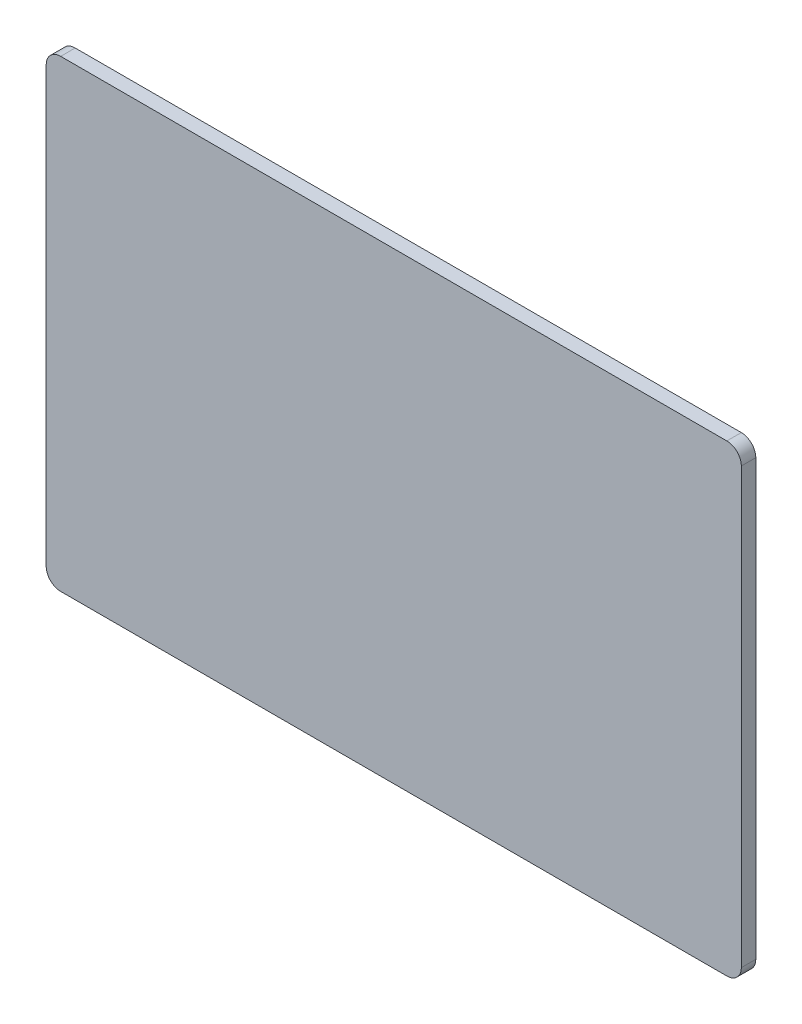
ISO-10303-21;
HEADER;
FILE_DESCRIPTION(('STEP AP214'),'2;1');
FILE_NAME('part.step','',(''),(''),'','','');
FILE_SCHEMA(('AUTOMOTIVE_DESIGN { 1 0 10303 214 1 1 1 1 }'));
ENDSEC;
DATA;
#1=APPLICATION_CONTEXT('core data for automotive mechanical design processes');
#2=APPLICATION_PROTOCOL_DEFINITION('international standard','automotive_design',2000,#1);
#3=PRODUCT_CONTEXT('',#1,'mechanical');
#4=PRODUCT('Part','Part','',(#3));
#5=PRODUCT_RELATED_PRODUCT_CATEGORY('part','',(#4));
#6=PRODUCT_DEFINITION_FORMATION('','',#4);
#7=PRODUCT_DEFINITION_CONTEXT('part definition',#1,'design');
#8=PRODUCT_DEFINITION('design','',#6,#7);
#9=PRODUCT_DEFINITION_SHAPE('','',#8);
#10=(LENGTH_UNIT() NAMED_UNIT(*) SI_UNIT(.MILLI.,.METRE.));
#11=(NAMED_UNIT(*) PLANE_ANGLE_UNIT() SI_UNIT($,.RADIAN.));
#12=(NAMED_UNIT(*) SI_UNIT($,.STERADIAN.) SOLID_ANGLE_UNIT());
#13=UNCERTAINTY_MEASURE_WITH_UNIT(LENGTH_MEASURE(1.E-05),#10,'distance_accuracy_value','');
#14=(GEOMETRIC_REPRESENTATION_CONTEXT(3) GLOBAL_UNCERTAINTY_ASSIGNED_CONTEXT((#13)) GLOBAL_UNIT_ASSIGNED_CONTEXT((#10,
#11,#12)) REPRESENTATION_CONTEXT('',''));
#15=CARTESIAN_POINT('',(0.,0.,0.));
#16=DIRECTION('',(0.,0.,1.));
#17=DIRECTION('',(1.,0.,0.));
#18=AXIS2_PLACEMENT_3D('',#15,#16,#17);
#19=CARTESIAN_POINT('',(0.,0.,1.5875));
#20=DIRECTION('',(1.,0.,0.));
#21=DIRECTION('',(0.,0.,-1.));
#22=AXIS2_PLACEMENT_3D('',#19,#20,#21);
#23=PLANE('',#22);
#24=DIRECTION('',(0.,-1.,0.));
#25=VECTOR('',#24,1.);
#26=CARTESIAN_POINT('',(0.,0.,0.));
#27=LINE('',#26,#25);
#28=CARTESIAN_POINT('',(0.,49.2125,0.));
#29=VERTEX_POINT('',#28);
#30=CARTESIAN_POINT('',(0.,1.5875,0.));
#31=VERTEX_POINT('',#30);
#32=EDGE_CURVE('E133',#29,#31,#27,.T.);
#33=ORIENTED_EDGE('',*,*,#32,.T.);
#34=DIRECTION('',(0.,0.,-1.));
#35=VECTOR('',#34,1.);
#36=CARTESIAN_POINT('',(0.,1.5875,1.5875));
#37=LINE('',#36,#35);
#38=CARTESIAN_POINT('',(0.,1.5875,1.5875));
#39=VERTEX_POINT('',#38);
#40=EDGE_CURVE('E112',#31,#39,#37,.F.);
#41=ORIENTED_EDGE('',*,*,#40,.T.);
#42=DIRECTION('',(0.,-1.,0.));
#43=VECTOR('',#42,1.);
#44=CARTESIAN_POINT('',(0.,0.,1.5875));
#45=LINE('',#44,#43);
#46=CARTESIAN_POINT('',(0.,49.2125,1.5875));
#47=VERTEX_POINT('',#46);
#48=EDGE_CURVE('E141',#47,#39,#45,.T.);
#49=ORIENTED_EDGE('',*,*,#48,.F.);
#50=DIRECTION('',(0.,0.,-1.));
#51=VECTOR('',#50,1.);
#52=CARTESIAN_POINT('',(0.,49.2125,1.5875));
#53=LINE('',#52,#51);
#54=EDGE_CURVE('E119',#47,#29,#53,.T.);
#55=ORIENTED_EDGE('',*,*,#54,.T.);
#56=EDGE_LOOP('',(#33,#41,#49,#55));
#57=FACE_BOUND('',#56,.T.);
#58=ADVANCED_FACE('F39',(#57),#23,.F.);
#59=CARTESIAN_POINT('',(0.,0.,1.5875));
#60=DIRECTION('',(0.,1.,0.));
#61=DIRECTION('',(0.,0.,1.));
#62=AXIS2_PLACEMENT_3D('',#59,#60,#61);
#63=PLANE('',#62);
#64=DIRECTION('',(1.,0.,0.));
#65=VECTOR('',#64,1.);
#66=CARTESIAN_POINT('',(0.,0.,1.5875));
#67=LINE('',#66,#65);
#68=CARTESIAN_POINT('',(1.5875,0.,1.5875));
#69=VERTEX_POINT('',#68);
#70=CARTESIAN_POINT('',(74.6125,0.,1.5875));
#71=VERTEX_POINT('',#70);
#72=EDGE_CURVE('E127',#69,#71,#67,.T.);
#73=ORIENTED_EDGE('',*,*,#72,.F.);
#74=DIRECTION('',(0.,0.,-1.));
#75=VECTOR('',#74,1.);
#76=CARTESIAN_POINT('',(1.5875,0.,1.5875));
#77=LINE('',#76,#75);
#78=CARTESIAN_POINT('',(1.5875,0.,0.));
#79=VERTEX_POINT('',#78);
#80=EDGE_CURVE('E109',#69,#79,#77,.T.);
#81=ORIENTED_EDGE('',*,*,#80,.T.);
#82=DIRECTION('',(1.,0.,0.));
#83=VECTOR('',#82,1.);
#84=CARTESIAN_POINT('',(0.,0.,0.));
#85=LINE('',#84,#83);
#86=CARTESIAN_POINT('',(74.6125,0.,0.));
#87=VERTEX_POINT('',#86);
#88=EDGE_CURVE('E122',#79,#87,#85,.T.);
#89=ORIENTED_EDGE('',*,*,#88,.T.);
#90=DIRECTION('',(0.,0.,-1.));
#91=VECTOR('',#90,1.);
#92=CARTESIAN_POINT('',(74.6125,0.,1.5875));
#93=LINE('',#92,#91);
#94=EDGE_CURVE('E126',#87,#71,#93,.F.);
#95=ORIENTED_EDGE('',*,*,#94,.T.);
#96=EDGE_LOOP('',(#73,#81,#89,#95));
#97=FACE_BOUND('',#96,.T.);
#98=ADVANCED_FACE('F125',(#97),#63,.F.);
#99=CARTESIAN_POINT('',(76.2,0.,1.5875));
#100=DIRECTION('',(-1.,0.,0.));
#101=DIRECTION('',(0.,0.,1.));
#102=AXIS2_PLACEMENT_3D('',#99,#100,#101);
#103=PLANE('',#102);
#104=DIRECTION('',(0.,1.,0.));
#105=VECTOR('',#104,1.);
#106=CARTESIAN_POINT('',(76.2,0.,1.5875));
#107=LINE('',#106,#105);
#108=CARTESIAN_POINT('',(76.2,1.5875,1.5875));
#109=VERTEX_POINT('',#108);
#110=CARTESIAN_POINT('',(76.2,49.2125,1.5875));
#111=VERTEX_POINT('',#110);
#112=EDGE_CURVE('E167',#109,#111,#107,.T.);
#113=ORIENTED_EDGE('',*,*,#112,.F.);
#114=DIRECTION('',(0.,0.,-1.));
#115=VECTOR('',#114,1.);
#116=CARTESIAN_POINT('',(76.2,1.5875,1.5875));
#117=LINE('',#116,#115);
#118=CARTESIAN_POINT('',(76.2,1.5875,0.));
#119=VERTEX_POINT('',#118);
#120=EDGE_CURVE('E11',#109,#119,#117,.T.);
#121=ORIENTED_EDGE('',*,*,#120,.T.);
#122=DIRECTION('',(0.,1.,0.));
#123=VECTOR('',#122,1.);
#124=CARTESIAN_POINT('',(76.2,0.,0.));
#125=LINE('',#124,#123);
#126=CARTESIAN_POINT('',(76.2,49.2125,0.));
#127=VERTEX_POINT('',#126);
#128=EDGE_CURVE('E135',#119,#127,#125,.T.);
#129=ORIENTED_EDGE('',*,*,#128,.T.);
#130=DIRECTION('',(0.,0.,-1.));
#131=VECTOR('',#130,1.);
#132=CARTESIAN_POINT('',(76.2,49.2125,1.5875));
#133=LINE('',#132,#131);
#134=EDGE_CURVE('E50',#127,#111,#133,.F.);
#135=ORIENTED_EDGE('',*,*,#134,.T.);
#136=EDGE_LOOP('',(#113,#121,#129,#135));
#137=FACE_BOUND('',#136,.T.);
#138=ADVANCED_FACE('F164',(#137),#103,.F.);
#139=CARTESIAN_POINT('',(0.,50.8,1.5875));
#140=DIRECTION('',(0.,-1.,0.));
#141=DIRECTION('',(0.,0.,-1.));
#142=AXIS2_PLACEMENT_3D('',#139,#140,#141);
#143=PLANE('',#142);
#144=DIRECTION('',(-1.,0.,0.));
#145=VECTOR('',#144,1.);
#146=CARTESIAN_POINT('',(0.,50.8,0.));
#147=LINE('',#146,#145);
#148=CARTESIAN_POINT('',(74.6125,50.8,0.));
#149=VERTEX_POINT('',#148);
#150=CARTESIAN_POINT('',(1.5875,50.8,0.));
#151=VERTEX_POINT('',#150);
#152=EDGE_CURVE('E140',#149,#151,#147,.T.);
#153=ORIENTED_EDGE('',*,*,#152,.T.);
#154=DIRECTION('',(0.,0.,-1.));
#155=VECTOR('',#154,1.);
#156=CARTESIAN_POINT('',(1.5875,50.8,1.5875));
#157=LINE('',#156,#155);
#158=CARTESIAN_POINT('',(1.5875,50.8,1.5875));
#159=VERTEX_POINT('',#158);
#160=EDGE_CURVE('E53',#151,#159,#157,.F.);
#161=ORIENTED_EDGE('',*,*,#160,.T.);
#162=DIRECTION('',(-1.,0.,0.));
#163=VECTOR('',#162,1.);
#164=CARTESIAN_POINT('',(0.,50.8,1.5875));
#165=LINE('',#164,#163);
#166=CARTESIAN_POINT('',(74.6125,50.8,1.5875));
#167=VERTEX_POINT('',#166);
#168=EDGE_CURVE('E145',#167,#159,#165,.T.);
#169=ORIENTED_EDGE('',*,*,#168,.F.);
#170=DIRECTION('',(0.,0.,-1.));
#171=VECTOR('',#170,1.);
#172=CARTESIAN_POINT('',(74.6125,50.8,1.5875));
#173=LINE('',#172,#171);
#174=EDGE_CURVE('E157',#167,#149,#173,.T.);
#175=ORIENTED_EDGE('',*,*,#174,.T.);
#176=EDGE_LOOP('',(#153,#161,#169,#175));
#177=FACE_BOUND('',#176,.T.);
#178=ADVANCED_FACE('F172',(#177),#143,.F.);
#179=CARTESIAN_POINT('',(0.,0.,1.5875));
#180=DIRECTION('',(0.,0.,-1.));
#181=DIRECTION('',(-1.,0.,0.));
#182=AXIS2_PLACEMENT_3D('',#179,#180,#181);
#183=PLANE('',#182);
#184=ORIENTED_EDGE('',*,*,#48,.T.);
#185=CARTESIAN_POINT('',(1.5875,1.5875,1.5875));
#186=DIRECTION('',(0.,0.,-1.));
#187=DIRECTION('',(-1.,0.,0.));
#188=AXIS2_PLACEMENT_3D('',#185,#186,#187);
#189=CIRCLE('',#188,1.5875);
#190=EDGE_CURVE('E160',#39,#69,#189,.F.);
#191=ORIENTED_EDGE('',*,*,#190,.T.);
#192=ORIENTED_EDGE('',*,*,#72,.T.);
#193=CARTESIAN_POINT('',(74.6125,1.5875,1.5875));
#194=DIRECTION('',(0.,0.,-1.));
#195=DIRECTION('',(-1.,0.,0.));
#196=AXIS2_PLACEMENT_3D('',#193,#194,#195);
#197=CIRCLE('',#196,1.5875);
#198=EDGE_CURVE('E153',#71,#109,#197,.F.);
#199=ORIENTED_EDGE('',*,*,#198,.T.);
#200=ORIENTED_EDGE('',*,*,#112,.T.);
#201=CARTESIAN_POINT('',(74.6125,49.2125,1.5875));
#202=DIRECTION('',(0.,0.,-1.));
#203=DIRECTION('',(-1.,0.,0.));
#204=AXIS2_PLACEMENT_3D('',#201,#202,#203);
#205=CIRCLE('',#204,1.5875);
#206=EDGE_CURVE('E64',#111,#167,#205,.F.);
#207=ORIENTED_EDGE('',*,*,#206,.T.);
#208=ORIENTED_EDGE('',*,*,#168,.T.);
#209=CARTESIAN_POINT('',(1.5875,49.2125,1.5875));
#210=DIRECTION('',(0.,0.,-1.));
#211=DIRECTION('',(-1.,0.,0.));
#212=AXIS2_PLACEMENT_3D('',#209,#210,#211);
#213=CIRCLE('',#212,1.5875);
#214=EDGE_CURVE('E154',#159,#47,#213,.F.);
#215=ORIENTED_EDGE('',*,*,#214,.T.);
#216=EDGE_LOOP('',(#184,#191,#192,#199,#200,#207,#208,#215));
#217=FACE_BOUND('',#216,.T.);
#218=ADVANCED_FACE('F168',(#217),#183,.F.);
#219=CARTESIAN_POINT('',(0.,0.,0.));
#220=DIRECTION('',(0.,0.,-1.));
#221=DIRECTION('',(-1.,0.,0.));
#222=AXIS2_PLACEMENT_3D('',#219,#220,#221);
#223=PLANE('',#222);
#224=ORIENTED_EDGE('',*,*,#88,.F.);
#225=CARTESIAN_POINT('',(1.5875,1.5875,0.));
#226=DIRECTION('',(0.,0.,-1.));
#227=DIRECTION('',(-1.,0.,0.));
#228=AXIS2_PLACEMENT_3D('',#225,#226,#227);
#229=CIRCLE('',#228,1.5875);
#230=EDGE_CURVE('E106',#79,#31,#229,.T.);
#231=ORIENTED_EDGE('',*,*,#230,.T.);
#232=ORIENTED_EDGE('',*,*,#32,.F.);
#233=CARTESIAN_POINT('',(1.5875,49.2125,0.));
#234=DIRECTION('',(0.,0.,-1.));
#235=DIRECTION('',(-1.,0.,0.));
#236=AXIS2_PLACEMENT_3D('',#233,#234,#235);
#237=CIRCLE('',#236,1.5875);
#238=EDGE_CURVE('E116',#29,#151,#237,.T.);
#239=ORIENTED_EDGE('',*,*,#238,.T.);
#240=ORIENTED_EDGE('',*,*,#152,.F.);
#241=CARTESIAN_POINT('',(74.6125,49.2125,0.));
#242=DIRECTION('',(0.,0.,-1.));
#243=DIRECTION('',(-1.,0.,0.));
#244=AXIS2_PLACEMENT_3D('',#241,#242,#243);
#245=CIRCLE('',#244,1.5875);
#246=EDGE_CURVE('E130',#149,#127,#245,.T.);
#247=ORIENTED_EDGE('',*,*,#246,.T.);
#248=ORIENTED_EDGE('',*,*,#128,.F.);
#249=CARTESIAN_POINT('',(74.6125,1.5875,0.));
#250=DIRECTION('',(0.,0.,-1.));
#251=DIRECTION('',(-1.,0.,0.));
#252=AXIS2_PLACEMENT_3D('',#249,#250,#251);
#253=CIRCLE('',#252,1.5875);
#254=EDGE_CURVE('E131',#119,#87,#253,.T.);
#255=ORIENTED_EDGE('',*,*,#254,.T.);
#256=EDGE_LOOP('',(#224,#231,#232,#239,#240,#247,#248,#255));
#257=FACE_BOUND('',#256,.T.);
#258=ADVANCED_FACE('F128',(#257),#223,.T.);
#259=CARTESIAN_POINT('',(1.5875,1.5875,1.5875));
#260=DIRECTION('',(0.,0.,-1.));
#261=DIRECTION('',(-1.,0.,0.));
#262=AXIS2_PLACEMENT_3D('',#259,#260,#261);
#263=CYLINDRICAL_SURFACE('',#262,1.5875);
#264=ORIENTED_EDGE('',*,*,#190,.F.);
#265=ORIENTED_EDGE('',*,*,#40,.F.);
#266=ORIENTED_EDGE('',*,*,#230,.F.);
#267=ORIENTED_EDGE('',*,*,#80,.F.);
#268=EDGE_LOOP('',(#264,#265,#266,#267));
#269=FACE_BOUND('',#268,.T.);
#270=ADVANCED_FACE('F108',(#269),#263,.T.);
#271=CARTESIAN_POINT('',(1.5875,49.2125,1.5875));
#272=DIRECTION('',(0.,0.,-1.));
#273=DIRECTION('',(-1.,0.,0.));
#274=AXIS2_PLACEMENT_3D('',#271,#272,#273);
#275=CYLINDRICAL_SURFACE('',#274,1.5875);
#276=ORIENTED_EDGE('',*,*,#214,.F.);
#277=ORIENTED_EDGE('',*,*,#160,.F.);
#278=ORIENTED_EDGE('',*,*,#238,.F.);
#279=ORIENTED_EDGE('',*,*,#54,.F.);
#280=EDGE_LOOP('',(#276,#277,#278,#279));
#281=FACE_BOUND('',#280,.T.);
#282=ADVANCED_FACE('F178',(#281),#275,.T.);
#283=CARTESIAN_POINT('',(74.6125,1.5875,1.5875));
#284=DIRECTION('',(0.,0.,-1.));
#285=DIRECTION('',(-1.,0.,0.));
#286=AXIS2_PLACEMENT_3D('',#283,#284,#285);
#287=CYLINDRICAL_SURFACE('',#286,1.5875);
#288=ORIENTED_EDGE('',*,*,#198,.F.);
#289=ORIENTED_EDGE('',*,*,#94,.F.);
#290=ORIENTED_EDGE('',*,*,#254,.F.);
#291=ORIENTED_EDGE('',*,*,#120,.F.);
#292=EDGE_LOOP('',(#288,#289,#290,#291));
#293=FACE_BOUND('',#292,.T.);
#294=ADVANCED_FACE('F183',(#293),#287,.T.);
#295=CARTESIAN_POINT('',(74.6125,49.2125,1.5875));
#296=DIRECTION('',(0.,0.,-1.));
#297=DIRECTION('',(-1.,0.,0.));
#298=AXIS2_PLACEMENT_3D('',#295,#296,#297);
#299=CYLINDRICAL_SURFACE('',#298,1.5875);
#300=ORIENTED_EDGE('',*,*,#206,.F.);
#301=ORIENTED_EDGE('',*,*,#134,.F.);
#302=ORIENTED_EDGE('',*,*,#246,.F.);
#303=ORIENTED_EDGE('',*,*,#174,.F.);
#304=EDGE_LOOP('',(#300,#301,#302,#303));
#305=FACE_BOUND('',#304,.T.);
#306=ADVANCED_FACE('F41',(#305),#299,.T.);
#307=CLOSED_SHELL('',(#58,#98,#138,#178,#218,#258,#270,#282,#294,#306));
#308=MANIFOLD_SOLID_BREP('B2',#307);
#309=ADVANCED_BREP_SHAPE_REPRESENTATION('',(#18,#308),#14);
#310=SHAPE_DEFINITION_REPRESENTATION(#9,#309);
ENDSEC;
END-ISO-10303-21;
